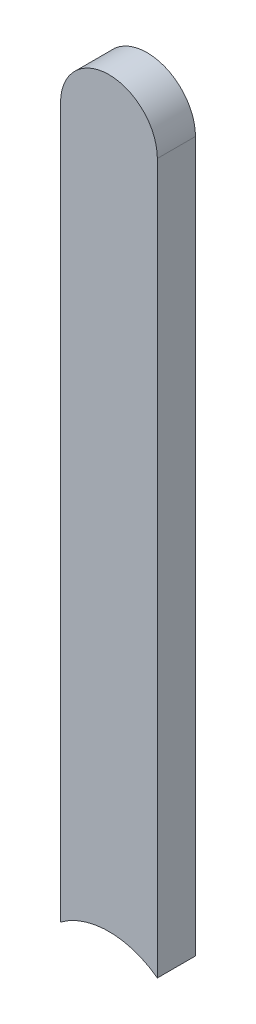
ISO-10303-21;
HEADER;
FILE_DESCRIPTION(('STEP AP214'),'2;1');
FILE_NAME('part.step','',(''),(''),'','','');
FILE_SCHEMA(('AUTOMOTIVE_DESIGN { 1 0 10303 214 1 1 1 1 }'));
ENDSEC;
DATA;
#1=APPLICATION_CONTEXT('core data for automotive mechanical design processes');
#2=APPLICATION_PROTOCOL_DEFINITION('international standard','automotive_design',2000,#1);
#3=PRODUCT_CONTEXT('',#1,'mechanical');
#4=PRODUCT('Part','Part','',(#3));
#5=PRODUCT_RELATED_PRODUCT_CATEGORY('part','',(#4));
#6=PRODUCT_DEFINITION_FORMATION('','',#4);
#7=PRODUCT_DEFINITION_CONTEXT('part definition',#1,'design');
#8=PRODUCT_DEFINITION('design','',#6,#7);
#9=PRODUCT_DEFINITION_SHAPE('','',#8);
#10=(LENGTH_UNIT() NAMED_UNIT(*) SI_UNIT(.MILLI.,.METRE.));
#11=(NAMED_UNIT(*) PLANE_ANGLE_UNIT() SI_UNIT($,.RADIAN.));
#12=(NAMED_UNIT(*) SI_UNIT($,.STERADIAN.) SOLID_ANGLE_UNIT());
#13=UNCERTAINTY_MEASURE_WITH_UNIT(LENGTH_MEASURE(1.E-05),#10,'distance_accuracy_value','');
#14=(GEOMETRIC_REPRESENTATION_CONTEXT(3) GLOBAL_UNCERTAINTY_ASSIGNED_CONTEXT((#13)) GLOBAL_UNIT_ASSIGNED_CONTEXT((#10,
#11,#12)) REPRESENTATION_CONTEXT('',''));
#15=CARTESIAN_POINT('',(0.,0.,0.));
#16=DIRECTION('',(0.,0.,1.));
#17=DIRECTION('',(1.,0.,0.));
#18=AXIS2_PLACEMENT_3D('',#15,#16,#17);
#19=CARTESIAN_POINT('',(135.255,108.925748231103,0.));
#20=DIRECTION('',(-1.,0.,0.));
#21=DIRECTION('',(0.,1.,0.));
#22=AXIS2_PLACEMENT_3D('',#19,#20,#21);
#23=PLANE('',#22);
#24=DIRECTION('',(0.,1.,0.));
#25=VECTOR('',#24,1.);
#26=CARTESIAN_POINT('',(135.255,108.585,0.1999996));
#27=LINE('',#26,#25);
#28=CARTESIAN_POINT('',(135.255,108.925748231103,0.1999996));
#29=VERTEX_POINT('',#28);
#30=CARTESIAN_POINT('',(135.255,112.649,0.1999996));
#31=VERTEX_POINT('',#30);
#32=EDGE_CURVE('E11',#29,#31,#27,.T.);
#33=ORIENTED_EDGE('',*,*,#32,.F.);
#34=DIRECTION('',(0.,0.,1.));
#35=VECTOR('',#34,1.);
#36=CARTESIAN_POINT('',(135.255,108.925748231103,0.));
#37=LINE('',#36,#35);
#38=CARTESIAN_POINT('',(135.255,108.925748231103,0.));
#39=VERTEX_POINT('',#38);
#40=EDGE_CURVE('E24',#39,#29,#37,.T.);
#41=ORIENTED_EDGE('',*,*,#40,.F.);
#42=DIRECTION('',(0.,1.,0.));
#43=VECTOR('',#42,1.);
#44=CARTESIAN_POINT('',(135.255,108.585,0.));
#45=LINE('',#44,#43);
#46=CARTESIAN_POINT('',(135.255,112.649,0.));
#47=VERTEX_POINT('',#46);
#48=EDGE_CURVE('E75',#39,#47,#45,.T.);
#49=ORIENTED_EDGE('',*,*,#48,.T.);
#50=DIRECTION('',(0.,0.,1.));
#51=VECTOR('',#50,1.);
#52=CARTESIAN_POINT('',(135.255,112.649,0.));
#53=LINE('',#52,#51);
#54=EDGE_CURVE('E37',#47,#31,#53,.T.);
#55=ORIENTED_EDGE('',*,*,#54,.T.);
#56=EDGE_LOOP('',(#33,#41,#49,#55));
#57=FACE_BOUND('',#56,.T.);
#58=ADVANCED_FACE('F17',(#57),#23,.F.);
#59=CARTESIAN_POINT('',(135.001,112.649,0.));
#60=DIRECTION('',(0.,0.,-1.));
#61=DIRECTION('',(1.,-1.11896493820492E-13,0.));
#62=AXIS2_PLACEMENT_3D('',#59,#60,#61);
#63=CYLINDRICAL_SURFACE('',#62,0.253999999999986);
#64=CARTESIAN_POINT('',(135.001,112.649,0.1999996));
#65=DIRECTION('',(0.,0.,1.));
#66=DIRECTION('',(1.,-1.11896493820492E-13,0.));
#67=AXIS2_PLACEMENT_3D('',#64,#65,#66);
#68=CIRCLE('',#67,0.253999999999986);
#69=CARTESIAN_POINT('',(134.747,112.649,0.1999996));
#70=VERTEX_POINT('',#69);
#71=EDGE_CURVE('E83',#31,#70,#68,.T.);
#72=ORIENTED_EDGE('',*,*,#71,.F.);
#73=ORIENTED_EDGE('',*,*,#54,.F.);
#74=CARTESIAN_POINT('',(135.001,112.649,0.));
#75=DIRECTION('',(0.,0.,1.));
#76=DIRECTION('',(1.,-1.11896493820492E-13,0.));
#77=AXIS2_PLACEMENT_3D('',#74,#75,#76);
#78=CIRCLE('',#77,0.253999999999986);
#79=CARTESIAN_POINT('',(134.747,112.649,0.));
#80=VERTEX_POINT('',#79);
#81=EDGE_CURVE('E81',#47,#80,#78,.T.);
#82=ORIENTED_EDGE('',*,*,#81,.T.);
#83=DIRECTION('',(0.,0.,1.));
#84=VECTOR('',#83,1.);
#85=CARTESIAN_POINT('',(134.747,112.649,0.));
#86=LINE('',#85,#84);
#87=EDGE_CURVE('E67',#80,#70,#86,.T.);
#88=ORIENTED_EDGE('',*,*,#87,.T.);
#89=EDGE_LOOP('',(#72,#73,#82,#88));
#90=FACE_BOUND('',#89,.T.);
#91=ADVANCED_FACE('F89',(#90),#63,.T.);
#92=CARTESIAN_POINT('',(134.747,112.649,0.));
#93=DIRECTION('',(1.,0.,0.));
#94=DIRECTION('',(0.,-1.,0.));
#95=AXIS2_PLACEMENT_3D('',#92,#93,#94);
#96=PLANE('',#95);
#97=DIRECTION('',(0.,-1.,0.));
#98=VECTOR('',#97,1.);
#99=CARTESIAN_POINT('',(134.747,112.649,0.1999996));
#100=LINE('',#99,#98);
#101=CARTESIAN_POINT('',(134.747,108.925748231103,0.1999996));
#102=VERTEX_POINT('',#101);
#103=EDGE_CURVE('E71',#70,#102,#100,.T.);
#104=ORIENTED_EDGE('',*,*,#103,.F.);
#105=ORIENTED_EDGE('',*,*,#87,.F.);
#106=DIRECTION('',(0.,-1.,0.));
#107=VECTOR('',#106,1.);
#108=CARTESIAN_POINT('',(134.747,112.649,0.));
#109=LINE('',#108,#107);
#110=CARTESIAN_POINT('',(134.747,108.925748231103,0.));
#111=VERTEX_POINT('',#110);
#112=EDGE_CURVE('E63',#80,#111,#109,.T.);
#113=ORIENTED_EDGE('',*,*,#112,.T.);
#114=DIRECTION('',(0.,0.,1.));
#115=VECTOR('',#114,1.);
#116=CARTESIAN_POINT('',(134.747,108.925748231103,0.));
#117=LINE('',#116,#115);
#118=EDGE_CURVE('E53',#111,#102,#117,.T.);
#119=ORIENTED_EDGE('',*,*,#118,.T.);
#120=EDGE_LOOP('',(#104,#105,#113,#119));
#121=FACE_BOUND('',#120,.T.);
#122=ADVANCED_FACE('F66',(#121),#96,.F.);
#123=CARTESIAN_POINT('',(135.001,108.585,0.));
#124=DIRECTION('',(0.,0.,-1.));
#125=DIRECTION('',(1.,0.,0.));
#126=AXIS2_PLACEMENT_3D('',#123,#124,#125);
#127=CYLINDRICAL_SURFACE('',#126,0.42500042);
#128=ORIENTED_EDGE('',*,*,#40,.T.);
#129=CARTESIAN_POINT('',(135.001,108.585,0.1999996));
#130=DIRECTION('',(0.,0.,1.));
#131=DIRECTION('',(1.,0.,0.));
#132=AXIS2_PLACEMENT_3D('',#129,#130,#131);
#133=CIRCLE('',#132,0.42500042);
#134=EDGE_CURVE('E59',#29,#102,#133,.T.);
#135=ORIENTED_EDGE('',*,*,#134,.T.);
#136=ORIENTED_EDGE('',*,*,#118,.F.);
#137=CARTESIAN_POINT('',(135.001,108.585,0.));
#138=DIRECTION('',(0.,0.,1.));
#139=DIRECTION('',(1.,0.,0.));
#140=AXIS2_PLACEMENT_3D('',#137,#138,#139);
#141=CIRCLE('',#140,0.42500042);
#142=EDGE_CURVE('E57',#39,#111,#141,.T.);
#143=ORIENTED_EDGE('',*,*,#142,.F.);
#144=EDGE_LOOP('',(#128,#135,#136,#143));
#145=FACE_BOUND('',#144,.T.);
#146=ADVANCED_FACE('F55',(#145),#127,.F.);
#147=CARTESIAN_POINT('',(135.255,108.585,0.));
#148=DIRECTION('',(0.,0.,-1.));
#149=DIRECTION('',(-1.,0.,0.));
#150=AXIS2_PLACEMENT_3D('',#147,#148,#149);
#151=PLANE('',#150);
#152=ORIENTED_EDGE('',*,*,#48,.F.);
#153=ORIENTED_EDGE('',*,*,#142,.T.);
#154=ORIENTED_EDGE('',*,*,#112,.F.);
#155=ORIENTED_EDGE('',*,*,#81,.F.);
#156=EDGE_LOOP('',(#152,#153,#154,#155));
#157=FACE_BOUND('',#156,.T.);
#158=ADVANCED_FACE('F74',(#157),#151,.T.);
#159=CARTESIAN_POINT('',(135.255,108.585,0.1999996));
#160=DIRECTION('',(0.,0.,-1.));
#161=DIRECTION('',(-1.,0.,0.));
#162=AXIS2_PLACEMENT_3D('',#159,#160,#161);
#163=PLANE('',#162);
#164=ORIENTED_EDGE('',*,*,#134,.F.);
#165=ORIENTED_EDGE('',*,*,#32,.T.);
#166=ORIENTED_EDGE('',*,*,#71,.T.);
#167=ORIENTED_EDGE('',*,*,#103,.T.);
#168=EDGE_LOOP('',(#164,#165,#166,#167));
#169=FACE_BOUND('',#168,.T.);
#170=ADVANCED_FACE('F91',(#169),#163,.F.);
#171=CLOSED_SHELL('',(#58,#91,#122,#146,#158,#170));
#172=MANIFOLD_SOLID_BREP('B1',#171);
#173=ADVANCED_BREP_SHAPE_REPRESENTATION('',(#18,#172),#14);
#174=SHAPE_DEFINITION_REPRESENTATION(#9,#173);
ENDSEC;
END-ISO-10303-21;
